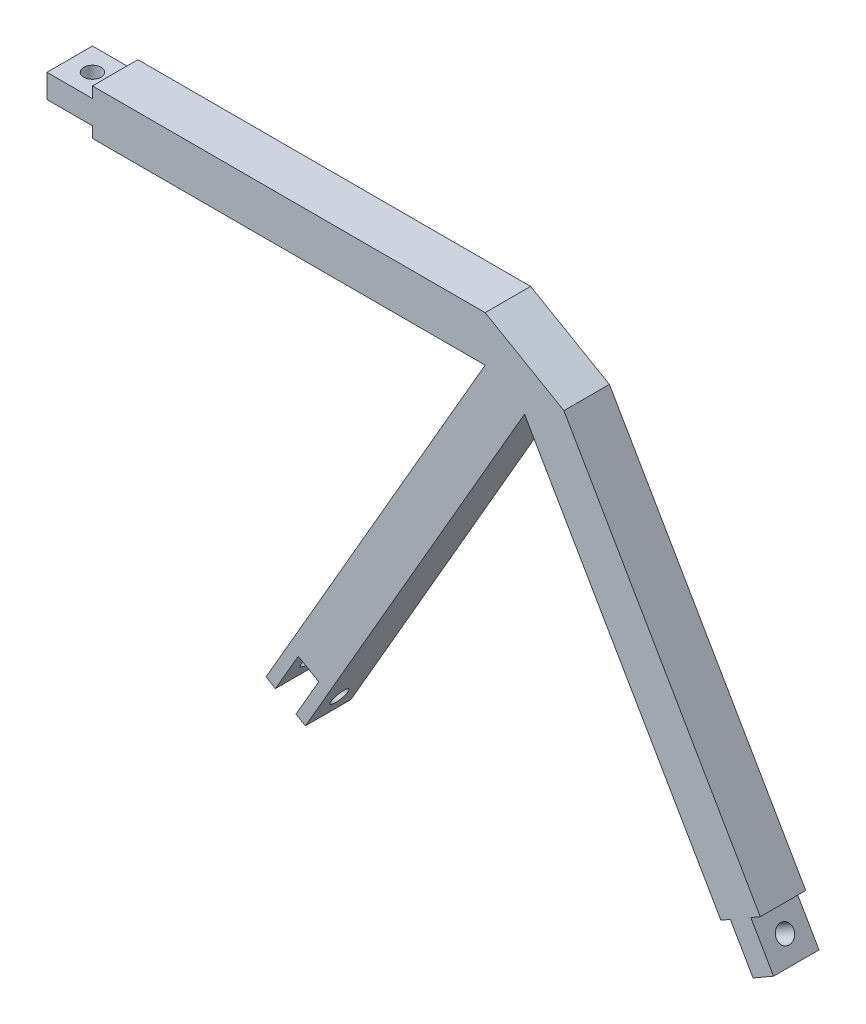
ISO-10303-21;
HEADER;
FILE_DESCRIPTION(('STEP AP214'),'2;1');
FILE_NAME('part.step','',(''),(''),'','','');
FILE_SCHEMA(('AUTOMOTIVE_DESIGN { 1 0 10303 214 1 1 1 1 }'));
ENDSEC;
DATA;
#1=APPLICATION_CONTEXT('core data for automotive mechanical design processes');
#2=APPLICATION_PROTOCOL_DEFINITION('international standard','automotive_design',2000,#1);
#3=PRODUCT_CONTEXT('',#1,'mechanical');
#4=PRODUCT('Part','Part','',(#3));
#5=PRODUCT_RELATED_PRODUCT_CATEGORY('part','',(#4));
#6=PRODUCT_DEFINITION_FORMATION('','',#4);
#7=PRODUCT_DEFINITION_CONTEXT('part definition',#1,'design');
#8=PRODUCT_DEFINITION('design','',#6,#7);
#9=PRODUCT_DEFINITION_SHAPE('','',#8);
#10=(LENGTH_UNIT() NAMED_UNIT(*) SI_UNIT(.MILLI.,.METRE.));
#11=(NAMED_UNIT(*) PLANE_ANGLE_UNIT() SI_UNIT($,.RADIAN.));
#12=(NAMED_UNIT(*) SI_UNIT($,.STERADIAN.) SOLID_ANGLE_UNIT());
#13=UNCERTAINTY_MEASURE_WITH_UNIT(LENGTH_MEASURE(1.E-05),#10,'distance_accuracy_value','');
#14=(GEOMETRIC_REPRESENTATION_CONTEXT(3) GLOBAL_UNCERTAINTY_ASSIGNED_CONTEXT((#13)) GLOBAL_UNIT_ASSIGNED_CONTEXT((#10,
#11,#12)) REPRESENTATION_CONTEXT('',''));
#15=CARTESIAN_POINT('',(0.,0.,0.));
#16=DIRECTION('',(0.,0.,1.));
#17=DIRECTION('',(1.,0.,0.));
#18=AXIS2_PLACEMENT_3D('',#15,#16,#17);
#19=CARTESIAN_POINT('',(-26.2499999999995,-41.1362066797606,0.));
#20=DIRECTION('',(-0.50000000000001,0.866025403784433,0.));
#21=DIRECTION('',(0.,0.,1.));
#22=AXIS2_PLACEMENT_3D('',#19,#20,#21);
#23=PLANE('',#22);
#24=DIRECTION('',(0.,0.,1.));
#25=VECTOR('',#24,1.);
#26=CARTESIAN_POINT('',(-25.1241669750798,-40.4862066797605,-2.5));
#27=LINE('',#26,#25);
#28=CARTESIAN_POINT('',(-25.1241669750798,-40.4862066797605,-2.5));
#29=VERTEX_POINT('',#28);
#30=CARTESIAN_POINT('',(-25.1241669750798,-40.4862066797605,2.5));
#31=VERTEX_POINT('',#30);
#32=EDGE_CURVE('E212',#29,#31,#27,.T.);
#33=ORIENTED_EDGE('',*,*,#32,.F.);
#34=DIRECTION('',(-0.866025403784433,-0.50000000000001,0.));
#35=VECTOR('',#34,1.);
#36=CARTESIAN_POINT('',(-24.0849364905384,-39.8862066797605,-2.5));
#37=LINE('',#36,#35);
#38=CARTESIAN_POINT('',(-24.0849364905384,-39.8862066797605,-2.5));
#39=VERTEX_POINT('',#38);
#40=EDGE_CURVE('E208',#39,#29,#37,.T.);
#41=ORIENTED_EDGE('',*,*,#40,.F.);
#42=DIRECTION('',(0.,0.,-1.));
#43=VECTOR('',#42,1.);
#44=CARTESIAN_POINT('',(-24.0849364905384,-39.8862066797605,-2.5));
#45=LINE('',#44,#43);
#46=CARTESIAN_POINT('',(-24.0849364905384,-39.8862066797605,2.5));
#47=VERTEX_POINT('',#46);
#48=EDGE_CURVE('E430',#47,#39,#45,.T.);
#49=ORIENTED_EDGE('',*,*,#48,.F.);
#50=DIRECTION('',(0.866025403784433,0.50000000000001,0.));
#51=VECTOR('',#50,1.);
#52=CARTESIAN_POINT('',(-24.0849364905384,-39.8862066797605,2.5));
#53=LINE('',#52,#51);
#54=EDGE_CURVE('E426',#31,#47,#53,.T.);
#55=ORIENTED_EDGE('',*,*,#54,.F.);
#56=EDGE_LOOP('',(#33,#41,#49,#55));
#57=FACE_BOUND('',#56,.T.);
#58=ADVANCED_FACE('F50',(#57),#23,.F.);
#59=CARTESIAN_POINT('',(-47.8349364905389,1.25000000000002,-2.5));
#60=DIRECTION('',(0.,0.,1.));
#61=DIRECTION('',(0.50000000000001,-0.866025403784433,0.));
#62=AXIS2_PLACEMENT_3D('',#59,#60,#61);
#63=PLANE('',#62);
#64=DIRECTION('',(0.866025403784445,-0.499999999999989,0.));
#65=VECTOR('',#64,1.);
#66=CARTESIAN_POINT('',(-12.4999999999997,-21.6506350946105,-2.5));
#67=LINE('',#66,#65);
#68=CARTESIAN_POINT('',(-54.3301270189222,2.5,-2.5));
#69=VERTEX_POINT('',#68);
#70=CARTESIAN_POINT('',(-45.6698729810778,-2.49999999999995,-2.5));
#71=VERTEX_POINT('',#70);
#72=EDGE_CURVE('E411',#69,#71,#67,.T.);
#73=ORIENTED_EDGE('',*,*,#72,.T.);
#74=DIRECTION('',(0.50000000000001,-0.866025403784433,0.));
#75=VECTOR('',#74,1.);
#76=CARTESIAN_POINT('',(-47.8349364905389,1.25000000000002,-2.5));
#77=LINE('',#76,#75);
#78=EDGE_CURVE('E434',#71,#39,#77,.T.);
#79=ORIENTED_EDGE('',*,*,#78,.T.);
#80=ORIENTED_EDGE('',*,*,#40,.T.);
#81=DIRECTION('',(-0.50000000000001,0.866025403784433,0.));
#82=VECTOR('',#81,1.);
#83=CARTESIAN_POINT('',(-25.1241669750798,-40.4862066797605,-2.5));
#84=LINE('',#83,#82);
#85=CARTESIAN_POINT('',(-22.6241669750797,-44.8163336986827,-2.5));
#86=VERTEX_POINT('',#85);
#87=EDGE_CURVE('E201',#86,#29,#84,.T.);
#88=ORIENTED_EDGE('',*,*,#87,.F.);
#89=DIRECTION('',(-0.866025403784433,-0.50000000000001,0.));
#90=VECTOR('',#89,1.);
#91=CARTESIAN_POINT('',(-22.6241669750797,-44.8163336986827,-2.5));
#92=LINE('',#91,#90);
#93=CARTESIAN_POINT('',(-24.8758330249192,-46.1163336986827,-2.5));
#94=VERTEX_POINT('',#93);
#95=EDGE_CURVE('E205',#86,#94,#92,.T.);
#96=ORIENTED_EDGE('',*,*,#95,.T.);
#97=DIRECTION('',(-0.50000000000001,0.866025403784433,0.));
#98=VECTOR('',#97,1.);
#99=CARTESIAN_POINT('',(-27.3758330249193,-41.7862066797606,-2.5));
#100=LINE('',#99,#98);
#101=CARTESIAN_POINT('',(-27.3758330249193,-41.7862066797606,-2.5));
#102=VERTEX_POINT('',#101);
#103=EDGE_CURVE('E479',#94,#102,#100,.T.);
#104=ORIENTED_EDGE('',*,*,#103,.T.);
#105=CARTESIAN_POINT('',(-28.4150635094606,-42.3862066797606,-2.5));
#106=VERTEX_POINT('',#105);
#107=EDGE_CURVE('E71',#102,#106,#37,.T.);
#108=ORIENTED_EDGE('',*,*,#107,.T.);
#109=DIRECTION('',(0.50000000000001,-0.866025403784433,0.));
#110=VECTOR('',#109,1.);
#111=CARTESIAN_POINT('',(-52.1650635094611,-1.25000000000002,-2.5));
#112=LINE('',#111,#110);
#113=CARTESIAN_POINT('',(-50.,-5.,-2.5));
#114=VERTEX_POINT('',#113);
#115=EDGE_CURVE('E12',#114,#106,#112,.T.);
#116=ORIENTED_EDGE('',*,*,#115,.F.);
#117=DIRECTION('',(-0.499999999999992,-0.866025403784443,0.));
#118=VECTOR('',#117,1.);
#119=CARTESIAN_POINT('',(-47.8349364905389,-1.24999999999998,-2.5));
#120=LINE('',#119,#118);
#121=CARTESIAN_POINT('',(-74.0849364905385,-46.7163336986833,-2.5));
#122=VERTEX_POINT('',#121);
#123=EDGE_CURVE('E360',#114,#122,#120,.T.);
#124=ORIENTED_EDGE('',*,*,#123,.T.);
#125=DIRECTION('',(-0.866025403784443,0.499999999999992,0.));
#126=VECTOR('',#125,1.);
#127=CARTESIAN_POINT('',(-74.0849364905385,-46.7163336986833,-2.5));
#128=LINE('',#127,#126);
#129=CARTESIAN_POINT('',(-75.1241669750798,-46.1163336986833,-2.5));
#130=VERTEX_POINT('',#129);
#131=EDGE_CURVE('E311',#122,#130,#128,.T.);
#132=ORIENTED_EDGE('',*,*,#131,.T.);
#133=DIRECTION('',(0.499999999999992,0.866025403784443,0.));
#134=VECTOR('',#133,1.);
#135=CARTESIAN_POINT('',(-72.6241669750798,-41.7862066797611,-2.5));
#136=LINE('',#135,#134);
#137=CARTESIAN_POINT('',(-72.6241669750798,-41.7862066797611,-2.5));
#138=VERTEX_POINT('',#137);
#139=EDGE_CURVE('E299',#130,#138,#136,.T.);
#140=ORIENTED_EDGE('',*,*,#139,.T.);
#141=DIRECTION('',(-0.866025403784443,0.499999999999992,0.));
#142=VECTOR('',#141,1.);
#143=CARTESIAN_POINT('',(-71.5849364905385,-42.386206679761,-2.5));
#144=LINE('',#143,#142);
#145=CARTESIAN_POINT('',(-74.8758330249194,-40.4862066797611,-2.5));
#146=VERTEX_POINT('',#145);
#147=EDGE_CURVE('E353',#138,#146,#144,.T.);
#148=ORIENTED_EDGE('',*,*,#147,.T.);
#149=DIRECTION('',(0.499999999999992,0.866025403784443,0.));
#150=VECTOR('',#149,1.);
#151=CARTESIAN_POINT('',(-74.8758330249194,-40.4862066797611,-2.5));
#152=LINE('',#151,#150);
#153=CARTESIAN_POINT('',(-77.3758330249193,-44.8163336986833,-2.5));
#154=VERTEX_POINT('',#153);
#155=EDGE_CURVE('E333',#154,#146,#152,.T.);
#156=ORIENTED_EDGE('',*,*,#155,.F.);
#157=DIRECTION('',(0.866025403784443,-0.499999999999992,0.));
#158=VECTOR('',#157,1.);
#159=CARTESIAN_POINT('',(-78.4150635094607,-44.2163336986833,-2.5));
#160=LINE('',#159,#158);
#161=CARTESIAN_POINT('',(-78.4150635094607,-44.2163336986833,-2.5));
#162=VERTEX_POINT('',#161);
#163=EDGE_CURVE('E328',#162,#154,#160,.T.);
#164=ORIENTED_EDGE('',*,*,#163,.F.);
#165=DIRECTION('',(-0.499999999999992,-0.866025403784443,0.));
#166=VECTOR('',#165,1.);
#167=CARTESIAN_POINT('',(-52.1650635094611,1.24999999999998,-2.5));
#168=LINE('',#167,#166);
#169=CARTESIAN_POINT('',(-54.3301270189222,-2.50000000000004,-2.5));
#170=VERTEX_POINT('',#169);
#171=EDGE_CURVE('E369',#170,#162,#168,.T.);
#172=ORIENTED_EDGE('',*,*,#171,.F.);
#173=DIRECTION('',(-1.,0.,0.));
#174=VECTOR('',#173,1.);
#175=CARTESIAN_POINT('',(-50.,-2.5,-2.5));
#176=LINE('',#175,#174);
#177=CARTESIAN_POINT('',(-97.5,-2.5,-2.5));
#178=VERTEX_POINT('',#177);
#179=EDGE_CURVE('E397',#170,#178,#176,.T.);
#180=ORIENTED_EDGE('',*,*,#179,.T.);
#181=DIRECTION('',(0.,1.,0.));
#182=VECTOR('',#181,1.);
#183=CARTESIAN_POINT('',(-97.5,-2.5,-2.5));
#184=LINE('',#183,#182);
#185=CARTESIAN_POINT('',(-97.5,-1.3,-2.5));
#186=VERTEX_POINT('',#185);
#187=EDGE_CURVE('E380',#178,#186,#184,.T.);
#188=ORIENTED_EDGE('',*,*,#187,.T.);
#189=DIRECTION('',(1.,0.,0.));
#190=VECTOR('',#189,1.);
#191=CARTESIAN_POINT('',(-97.5,-1.3,-2.5));
#192=LINE('',#191,#190);
#193=CARTESIAN_POINT('',(-102.5,-1.3,-2.5));
#194=VERTEX_POINT('',#193);
#195=EDGE_CURVE('E249',#194,#186,#192,.T.);
#196=ORIENTED_EDGE('',*,*,#195,.F.);
#197=DIRECTION('',(0.,1.,0.));
#198=VECTOR('',#197,1.);
#199=CARTESIAN_POINT('',(-102.5,-1.3,-2.5));
#200=LINE('',#199,#198);
#201=CARTESIAN_POINT('',(-102.5,1.3,-2.5));
#202=VERTEX_POINT('',#201);
#203=EDGE_CURVE('E277',#194,#202,#200,.T.);
#204=ORIENTED_EDGE('',*,*,#203,.T.);
#205=DIRECTION('',(1.,0.,0.));
#206=VECTOR('',#205,1.);
#207=CARTESIAN_POINT('',(-97.5,1.3,-2.5));
#208=LINE('',#207,#206);
#209=CARTESIAN_POINT('',(-97.5,1.3,-2.5));
#210=VERTEX_POINT('',#209);
#211=EDGE_CURVE('E265',#202,#210,#208,.T.);
#212=ORIENTED_EDGE('',*,*,#211,.T.);
#213=CARTESIAN_POINT('',(-97.5,2.5,-2.5));
#214=VERTEX_POINT('',#213);
#215=EDGE_CURVE('E379',#210,#214,#184,.T.);
#216=ORIENTED_EDGE('',*,*,#215,.T.);
#217=DIRECTION('',(-1.,0.,0.));
#218=VECTOR('',#217,1.);
#219=CARTESIAN_POINT('',(-50.,2.5,-2.5));
#220=LINE('',#219,#218);
#221=EDGE_CURVE('E407',#69,#214,#220,.T.);
#222=ORIENTED_EDGE('',*,*,#221,.F.);
#223=EDGE_LOOP('',(#73,#79,#80,#88,#96,#104,#108,#116,#124,#132,#140,#148,#156,#164,#172,#180,
#188,#196,#204,#212,#216,#222));
#224=FACE_BOUND('',#223,.T.);
#225=ADVANCED_FACE('F52',(#224),#63,.F.);
#226=CARTESIAN_POINT('',(-47.8349364905389,1.25000000000002,2.5));
#227=DIRECTION('',(0.,0.,-1.));
#228=DIRECTION('',(-0.50000000000001,0.866025403784433,0.));
#229=AXIS2_PLACEMENT_3D('',#226,#227,#228);
#230=PLANE('',#229);
#231=DIRECTION('',(-0.866025403784445,0.499999999999989,0.));
#232=VECTOR('',#231,1.);
#233=CARTESIAN_POINT('',(-12.4999999999997,-21.6506350946105,2.5));
#234=LINE('',#233,#232);
#235=CARTESIAN_POINT('',(-45.6698729810778,-2.49999999999995,2.5));
#236=VERTEX_POINT('',#235);
#237=CARTESIAN_POINT('',(-54.3301270189222,2.5,2.5));
#238=VERTEX_POINT('',#237);
#239=EDGE_CURVE('E412',#236,#238,#234,.T.);
#240=ORIENTED_EDGE('',*,*,#239,.T.);
#241=DIRECTION('',(-1.,0.,0.));
#242=VECTOR('',#241,1.);
#243=CARTESIAN_POINT('',(-50.,2.5,2.5));
#244=LINE('',#243,#242);
#245=CARTESIAN_POINT('',(-97.5,2.5,2.5));
#246=VERTEX_POINT('',#245);
#247=EDGE_CURVE('E404',#238,#246,#244,.T.);
#248=ORIENTED_EDGE('',*,*,#247,.T.);
#249=DIRECTION('',(0.,-1.,0.));
#250=VECTOR('',#249,1.);
#251=CARTESIAN_POINT('',(-97.5,-2.5,2.5));
#252=LINE('',#251,#250);
#253=CARTESIAN_POINT('',(-97.5,1.3,2.5));
#254=VERTEX_POINT('',#253);
#255=EDGE_CURVE('E389',#246,#254,#252,.T.);
#256=ORIENTED_EDGE('',*,*,#255,.T.);
#257=DIRECTION('',(-1.,0.,0.));
#258=VECTOR('',#257,1.);
#259=CARTESIAN_POINT('',(-97.5,1.3,2.5));
#260=LINE('',#259,#258);
#261=CARTESIAN_POINT('',(-102.5,1.3,2.5));
#262=VERTEX_POINT('',#261);
#263=EDGE_CURVE('E250',#254,#262,#260,.T.);
#264=ORIENTED_EDGE('',*,*,#263,.T.);
#265=DIRECTION('',(0.,1.,0.));
#266=VECTOR('',#265,1.);
#267=CARTESIAN_POINT('',(-102.5,-1.3,2.5));
#268=LINE('',#267,#266);
#269=CARTESIAN_POINT('',(-102.5,-1.3,2.5));
#270=VERTEX_POINT('',#269);
#271=EDGE_CURVE('E261',#270,#262,#268,.T.);
#272=ORIENTED_EDGE('',*,*,#271,.F.);
#273=DIRECTION('',(-1.,0.,0.));
#274=VECTOR('',#273,1.);
#275=CARTESIAN_POINT('',(-97.5,-1.3,2.5));
#276=LINE('',#275,#274);
#277=CARTESIAN_POINT('',(-97.5,-1.3,2.5));
#278=VERTEX_POINT('',#277);
#279=EDGE_CURVE('E258',#278,#270,#276,.T.);
#280=ORIENTED_EDGE('',*,*,#279,.F.);
#281=CARTESIAN_POINT('',(-97.5,-2.5,2.5));
#282=VERTEX_POINT('',#281);
#283=EDGE_CURVE('E388',#278,#282,#252,.T.);
#284=ORIENTED_EDGE('',*,*,#283,.T.);
#285=DIRECTION('',(-1.,0.,0.));
#286=VECTOR('',#285,1.);
#287=CARTESIAN_POINT('',(-50.,-2.5,2.5));
#288=LINE('',#287,#286);
#289=CARTESIAN_POINT('',(-54.3301270189222,-2.50000000000004,2.5));
#290=VERTEX_POINT('',#289);
#291=EDGE_CURVE('E400',#290,#282,#288,.T.);
#292=ORIENTED_EDGE('',*,*,#291,.F.);
#293=DIRECTION('',(-0.499999999999992,-0.866025403784443,0.));
#294=VECTOR('',#293,1.);
#295=CARTESIAN_POINT('',(-52.1650635094611,1.24999999999998,2.5));
#296=LINE('',#295,#294);
#297=CARTESIAN_POINT('',(-78.4150635094607,-44.2163336986833,2.5));
#298=VERTEX_POINT('',#297);
#299=EDGE_CURVE('E366',#290,#298,#296,.T.);
#300=ORIENTED_EDGE('',*,*,#299,.T.);
#301=DIRECTION('',(0.866025403784443,-0.499999999999992,0.));
#302=VECTOR('',#301,1.);
#303=CARTESIAN_POINT('',(-78.4150635094607,-44.2163336986833,2.5));
#304=LINE('',#303,#302);
#305=CARTESIAN_POINT('',(-77.3758330249193,-44.8163336986833,2.5));
#306=VERTEX_POINT('',#305);
#307=EDGE_CURVE('E344',#298,#306,#304,.T.);
#308=ORIENTED_EDGE('',*,*,#307,.T.);
#309=DIRECTION('',(-0.499999999999992,-0.866025403784443,0.));
#310=VECTOR('',#309,1.);
#311=CARTESIAN_POINT('',(-74.8758330249194,-40.4862066797611,2.5));
#312=LINE('',#311,#310);
#313=CARTESIAN_POINT('',(-74.8758330249194,-40.4862066797611,2.5));
#314=VERTEX_POINT('',#313);
#315=EDGE_CURVE('E329',#314,#306,#312,.T.);
#316=ORIENTED_EDGE('',*,*,#315,.F.);
#317=DIRECTION('',(0.866025403784443,-0.499999999999992,0.));
#318=VECTOR('',#317,1.);
#319=CARTESIAN_POINT('',(-71.5849364905385,-42.386206679761,2.5));
#320=LINE('',#319,#318);
#321=CARTESIAN_POINT('',(-72.6241669750798,-41.7862066797611,2.5));
#322=VERTEX_POINT('',#321);
#323=EDGE_CURVE('E356',#314,#322,#320,.T.);
#324=ORIENTED_EDGE('',*,*,#323,.T.);
#325=DIRECTION('',(-0.499999999999992,-0.866025403784443,0.));
#326=VECTOR('',#325,1.);
#327=CARTESIAN_POINT('',(-72.6241669750798,-41.7862066797611,2.5));
#328=LINE('',#327,#326);
#329=CARTESIAN_POINT('',(-75.1241669750798,-46.1163336986833,2.5));
#330=VERTEX_POINT('',#329);
#331=EDGE_CURVE('E295',#322,#330,#328,.T.);
#332=ORIENTED_EDGE('',*,*,#331,.T.);
#333=DIRECTION('',(-0.866025403784443,0.499999999999992,0.));
#334=VECTOR('',#333,1.);
#335=CARTESIAN_POINT('',(-74.0849364905385,-46.7163336986833,2.5));
#336=LINE('',#335,#334);
#337=CARTESIAN_POINT('',(-74.0849364905385,-46.7163336986833,2.5));
#338=VERTEX_POINT('',#337);
#339=EDGE_CURVE('E294',#338,#330,#336,.T.);
#340=ORIENTED_EDGE('',*,*,#339,.F.);
#341=DIRECTION('',(-0.499999999999992,-0.866025403784443,0.));
#342=VECTOR('',#341,1.);
#343=CARTESIAN_POINT('',(-47.8349364905389,-1.24999999999998,2.5));
#344=LINE('',#343,#342);
#345=CARTESIAN_POINT('',(-50.,-5.,2.5));
#346=VERTEX_POINT('',#345);
#347=EDGE_CURVE('E363',#346,#338,#344,.T.);
#348=ORIENTED_EDGE('',*,*,#347,.F.);
#349=DIRECTION('',(0.50000000000001,-0.866025403784433,0.));
#350=VECTOR('',#349,1.);
#351=CARTESIAN_POINT('',(-52.1650635094611,-1.25000000000002,2.5));
#352=LINE('',#351,#350);
#353=CARTESIAN_POINT('',(-28.4150635094606,-42.3862066797606,2.5));
#354=VERTEX_POINT('',#353);
#355=EDGE_CURVE('E59',#346,#354,#352,.T.);
#356=ORIENTED_EDGE('',*,*,#355,.T.);
#357=CARTESIAN_POINT('',(-27.3758330249193,-41.7862066797606,2.5));
#358=VERTEX_POINT('',#357);
#359=EDGE_CURVE('E427',#354,#358,#53,.T.);
#360=ORIENTED_EDGE('',*,*,#359,.T.);
#361=DIRECTION('',(0.50000000000001,-0.866025403784433,0.));
#362=VECTOR('',#361,1.);
#363=CARTESIAN_POINT('',(-27.3758330249193,-41.7862066797606,2.5));
#364=LINE('',#363,#362);
#365=CARTESIAN_POINT('',(-24.8758330249192,-46.1163336986827,2.5));
#366=VERTEX_POINT('',#365);
#367=EDGE_CURVE('E224',#358,#366,#364,.T.);
#368=ORIENTED_EDGE('',*,*,#367,.T.);
#369=DIRECTION('',(-0.866025403784433,-0.50000000000001,0.));
#370=VECTOR('',#369,1.);
#371=CARTESIAN_POINT('',(-22.6241669750797,-44.8163336986827,2.5));
#372=LINE('',#371,#370);
#373=CARTESIAN_POINT('',(-22.6241669750797,-44.8163336986827,2.5));
#374=VERTEX_POINT('',#373);
#375=EDGE_CURVE('E231',#374,#366,#372,.T.);
#376=ORIENTED_EDGE('',*,*,#375,.F.);
#377=DIRECTION('',(0.50000000000001,-0.866025403784433,0.));
#378=VECTOR('',#377,1.);
#379=CARTESIAN_POINT('',(-25.1241669750798,-40.4862066797605,2.5));
#380=LINE('',#379,#378);
#381=EDGE_CURVE('E219',#31,#374,#380,.T.);
#382=ORIENTED_EDGE('',*,*,#381,.F.);
#383=ORIENTED_EDGE('',*,*,#54,.T.);
#384=DIRECTION('',(0.50000000000001,-0.866025403784433,0.));
#385=VECTOR('',#384,1.);
#386=CARTESIAN_POINT('',(-47.8349364905389,1.25000000000002,2.5));
#387=LINE('',#386,#385);
#388=EDGE_CURVE('E437',#236,#47,#387,.T.);
#389=ORIENTED_EDGE('',*,*,#388,.F.);
#390=EDGE_LOOP('',(#240,#248,#256,#264,#272,#280,#284,#292,#300,#308,#316,#324,#332,#340,#348,
#356,#360,#368,#376,#382,#383,#389));
#391=FACE_BOUND('',#390,.T.);
#392=ADVANCED_FACE('F444',(#391),#230,.F.);
#393=CARTESIAN_POINT('',(-47.8349364905389,1.25000000000002,-2.5));
#394=DIRECTION('',(-0.866025403784433,-0.50000000000001,0.));
#395=DIRECTION('',(0.,0.,-1.));
#396=AXIS2_PLACEMENT_3D('',#393,#394,#395);
#397=PLANE('',#396);
#398=DIRECTION('',(0.,0.,-1.));
#399=VECTOR('',#398,1.);
#400=CARTESIAN_POINT('',(-45.6698729810778,-2.49999999999995,7.5));
#401=LINE('',#400,#399);
#402=EDGE_CURVE('E415',#236,#71,#401,.T.);
#403=ORIENTED_EDGE('',*,*,#402,.F.);
#404=ORIENTED_EDGE('',*,*,#388,.T.);
#405=ORIENTED_EDGE('',*,*,#48,.T.);
#406=ORIENTED_EDGE('',*,*,#78,.F.);
#407=EDGE_LOOP('',(#403,#404,#405,#406));
#408=FACE_BOUND('',#407,.T.);
#409=ADVANCED_FACE('F463',(#408),#397,.F.);
#410=CARTESIAN_POINT('',(-52.1650635094611,-1.25000000000002,-2.5));
#411=DIRECTION('',(0.866025403784433,0.50000000000001,0.));
#412=DIRECTION('',(0.,0.,1.));
#413=AXIS2_PLACEMENT_3D('',#410,#411,#412);
#414=PLANE('',#413);
#415=ORIENTED_EDGE('',*,*,#355,.F.);
#416=DIRECTION('',(0.,0.,-1.));
#417=VECTOR('',#416,1.);
#418=CARTESIAN_POINT('',(-50.,-5.,7.5));
#419=LINE('',#418,#417);
#420=EDGE_CURVE('E347',#346,#114,#419,.T.);
#421=ORIENTED_EDGE('',*,*,#420,.T.);
#422=ORIENTED_EDGE('',*,*,#115,.T.);
#423=DIRECTION('',(0.,0.,1.));
#424=VECTOR('',#423,1.);
#425=CARTESIAN_POINT('',(-28.4150635094606,-42.3862066797606,-2.5));
#426=LINE('',#425,#424);
#427=EDGE_CURVE('E422',#106,#354,#426,.T.);
#428=ORIENTED_EDGE('',*,*,#427,.T.);
#429=EDGE_LOOP('',(#415,#421,#422,#428));
#430=FACE_BOUND('',#429,.T.);
#431=ADVANCED_FACE('F448',(#430),#414,.F.);
#432=ORIENTED_EDGE('',*,*,#107,.F.);
#433=DIRECTION('',(0.,0.,1.));
#434=VECTOR('',#433,1.);
#435=CARTESIAN_POINT('',(-27.3758330249193,-41.7862066797606,-2.5));
#436=LINE('',#435,#434);
#437=EDGE_CURVE('E66',#102,#358,#436,.T.);
#438=ORIENTED_EDGE('',*,*,#437,.T.);
#439=ORIENTED_EDGE('',*,*,#359,.F.);
#440=ORIENTED_EDGE('',*,*,#427,.F.);
#441=EDGE_LOOP('',(#432,#438,#439,#440));
#442=FACE_BOUND('',#441,.T.);
#443=ADVANCED_FACE('F450',(#442),#23,.F.);
#444=CARTESIAN_POINT('',(-12.4999999999997,-21.6506350946105,7.5));
#445=DIRECTION('',(0.499999999999989,0.866025403784445,0.));
#446=DIRECTION('',(-0.866025403784445,0.499999999999989,0.));
#447=AXIS2_PLACEMENT_3D('',#444,#445,#446);
#448=PLANE('',#447);
#449=ORIENTED_EDGE('',*,*,#402,.T.);
#450=ORIENTED_EDGE('',*,*,#72,.F.);
#451=DIRECTION('',(0.,0.,-1.));
#452=VECTOR('',#451,1.);
#453=CARTESIAN_POINT('',(-54.3301270189222,2.5,7.5));
#454=LINE('',#453,#452);
#455=EDGE_CURVE('E375',#238,#69,#454,.T.);
#456=ORIENTED_EDGE('',*,*,#455,.F.);
#457=ORIENTED_EDGE('',*,*,#239,.F.);
#458=EDGE_LOOP('',(#449,#450,#456,#457));
#459=FACE_BOUND('',#458,.T.);
#460=ADVANCED_FACE('F452',(#459),#448,.T.);
#461=CARTESIAN_POINT('',(-97.5,0.,0.));
#462=DIRECTION('',(1.,0.,0.));
#463=DIRECTION('',(0.,0.,1.));
#464=AXIS2_PLACEMENT_3D('',#461,#462,#463);
#465=PLANE('',#464);
#466=DIRECTION('',(0.,0.,1.));
#467=VECTOR('',#466,1.);
#468=CARTESIAN_POINT('',(-97.5,-1.3,-2.5));
#469=LINE('',#468,#467);
#470=EDGE_CURVE('E254',#186,#278,#469,.T.);
#471=ORIENTED_EDGE('',*,*,#470,.F.);
#472=ORIENTED_EDGE('',*,*,#187,.F.);
#473=DIRECTION('',(0.,0.,-1.));
#474=VECTOR('',#473,1.);
#475=CARTESIAN_POINT('',(-97.5,-2.5,-2.5));
#476=LINE('',#475,#474);
#477=EDGE_CURVE('E393',#282,#178,#476,.T.);
#478=ORIENTED_EDGE('',*,*,#477,.F.);
#479=ORIENTED_EDGE('',*,*,#283,.F.);
#480=EDGE_LOOP('',(#471,#472,#478,#479));
#481=FACE_BOUND('',#480,.T.);
#482=ADVANCED_FACE('F459',(#481),#465,.F.);
#483=CARTESIAN_POINT('',(-50.,-2.5,-2.5));
#484=DIRECTION('',(0.,1.,0.));
#485=DIRECTION('',(0.,0.,-1.));
#486=AXIS2_PLACEMENT_3D('',#483,#484,#485);
#487=PLANE('',#486);
#488=DIRECTION('',(0.,0.,-1.));
#489=VECTOR('',#488,1.);
#490=CARTESIAN_POINT('',(-54.3301270189222,-2.5,7.5));
#491=LINE('',#490,#489);
#492=EDGE_CURVE('E372',#290,#170,#491,.T.);
#493=ORIENTED_EDGE('',*,*,#492,.F.);
#494=ORIENTED_EDGE('',*,*,#291,.T.);
#495=ORIENTED_EDGE('',*,*,#477,.T.);
#496=ORIENTED_EDGE('',*,*,#179,.F.);
#497=EDGE_LOOP('',(#493,#494,#495,#496));
#498=FACE_BOUND('',#497,.T.);
#499=ADVANCED_FACE('F524',(#498),#487,.F.);
#500=CARTESIAN_POINT('',(-50.,2.5,-2.5));
#501=DIRECTION('',(0.,-1.,0.));
#502=DIRECTION('',(0.,0.,1.));
#503=AXIS2_PLACEMENT_3D('',#500,#501,#502);
#504=PLANE('',#503);
#505=ORIENTED_EDGE('',*,*,#247,.F.);
#506=ORIENTED_EDGE('',*,*,#455,.T.);
#507=ORIENTED_EDGE('',*,*,#221,.T.);
#508=DIRECTION('',(0.,0.,1.));
#509=VECTOR('',#508,1.);
#510=CARTESIAN_POINT('',(-97.5,2.5,-2.5));
#511=LINE('',#510,#509);
#512=EDGE_CURVE('E384',#214,#246,#511,.T.);
#513=ORIENTED_EDGE('',*,*,#512,.T.);
#514=EDGE_LOOP('',(#505,#506,#507,#513));
#515=FACE_BOUND('',#514,.T.);
#516=ADVANCED_FACE('F497',(#515),#504,.F.);
#517=ORIENTED_EDGE('',*,*,#215,.F.);
#518=DIRECTION('',(0.,0.,1.));
#519=VECTOR('',#518,1.);
#520=CARTESIAN_POINT('',(-97.5,1.3,-2.5));
#521=LINE('',#520,#519);
#522=EDGE_CURVE('E269',#210,#254,#521,.T.);
#523=ORIENTED_EDGE('',*,*,#522,.T.);
#524=ORIENTED_EDGE('',*,*,#255,.F.);
#525=ORIENTED_EDGE('',*,*,#512,.F.);
#526=EDGE_LOOP('',(#517,#523,#524,#525));
#527=FACE_BOUND('',#526,.T.);
#528=ADVANCED_FACE('F500',(#527),#465,.F.);
#529=CARTESIAN_POINT('',(-73.7499999999996,-41.1362066797611,0.));
#530=DIRECTION('',(0.499999999999992,0.866025403784443,0.));
#531=DIRECTION('',(0.,0.,1.));
#532=AXIS2_PLACEMENT_3D('',#529,#530,#531);
#533=PLANE('',#532);
#534=ORIENTED_EDGE('',*,*,#147,.F.);
#535=DIRECTION('',(0.,0.,1.));
#536=VECTOR('',#535,1.);
#537=CARTESIAN_POINT('',(-72.6241669750798,-41.7862066797611,-2.5));
#538=LINE('',#537,#536);
#539=EDGE_CURVE('E302',#138,#322,#538,.T.);
#540=ORIENTED_EDGE('',*,*,#539,.T.);
#541=ORIENTED_EDGE('',*,*,#323,.F.);
#542=DIRECTION('',(0.,0.,1.));
#543=VECTOR('',#542,1.);
#544=CARTESIAN_POINT('',(-74.8758330249194,-40.4862066797611,-2.5));
#545=LINE('',#544,#543);
#546=EDGE_CURVE('E337',#146,#314,#545,.T.);
#547=ORIENTED_EDGE('',*,*,#546,.F.);
#548=EDGE_LOOP('',(#534,#540,#541,#547));
#549=FACE_BOUND('',#548,.T.);
#550=ADVANCED_FACE('F540',(#549),#533,.F.);
#551=CARTESIAN_POINT('',(-47.8349364905389,-1.24999999999998,-2.5));
#552=DIRECTION('',(-0.866025403784443,0.499999999999992,0.));
#553=DIRECTION('',(0.,0.,-1.));
#554=AXIS2_PLACEMENT_3D('',#551,#552,#553);
#555=PLANE('',#554);
#556=ORIENTED_EDGE('',*,*,#420,.F.);
#557=ORIENTED_EDGE('',*,*,#347,.T.);
#558=DIRECTION('',(0.,0.,-1.));
#559=VECTOR('',#558,1.);
#560=CARTESIAN_POINT('',(-74.0849364905385,-46.7163336986833,-2.5));
#561=LINE('',#560,#559);
#562=EDGE_CURVE('E290',#338,#122,#561,.T.);
#563=ORIENTED_EDGE('',*,*,#562,.T.);
#564=ORIENTED_EDGE('',*,*,#123,.F.);
#565=EDGE_LOOP('',(#556,#557,#563,#564));
#566=FACE_BOUND('',#565,.T.);
#567=CARTESIAN_POINT('',(-72.8349364905385,-44.5512701892222,0.));
#568=DIRECTION('',(0.866025403784443,-0.499999999999992,0.));
#569=DIRECTION('',(0.,0.,1.));
#570=AXIS2_PLACEMENT_3D('',#567,#568,#569);
#571=CIRCLE('',#570,0.95);
#572=CARTESIAN_POINT('',(-72.8349364905385,-44.5512701892222,0.95));
#573=VERTEX_POINT('',#572);
#574=EDGE_CURVE('E282',#573,#573,#571,.T.);
#575=ORIENTED_EDGE('',*,*,#574,.F.);
#576=EDGE_LOOP('',(#575));
#577=FACE_BOUND('',#576,.T.);
#578=ADVANCED_FACE('F551',(#566,#577),#555,.F.);
#579=CARTESIAN_POINT('',(-52.1650635094611,1.24999999999998,-2.5));
#580=DIRECTION('',(0.866025403784443,-0.499999999999992,0.));
#581=DIRECTION('',(0.,0.,1.));
#582=AXIS2_PLACEMENT_3D('',#579,#580,#581);
#583=PLANE('',#582);
#584=ORIENTED_EDGE('',*,*,#299,.F.);
#585=ORIENTED_EDGE('',*,*,#492,.T.);
#586=ORIENTED_EDGE('',*,*,#171,.T.);
#587=DIRECTION('',(0.,0.,-1.));
#588=VECTOR('',#587,1.);
#589=CARTESIAN_POINT('',(-78.4150635094607,-44.2163336986833,-2.5));
#590=LINE('',#589,#588);
#591=EDGE_CURVE('E324',#298,#162,#590,.T.);
#592=ORIENTED_EDGE('',*,*,#591,.F.);
#593=EDGE_LOOP('',(#584,#585,#586,#592));
#594=FACE_BOUND('',#593,.T.);
#595=CARTESIAN_POINT('',(-77.1650635094607,-42.0512701892222,0.));
#596=DIRECTION('',(0.866025403784443,-0.499999999999992,0.));
#597=DIRECTION('',(0.,0.,1.));
#598=AXIS2_PLACEMENT_3D('',#595,#596,#597);
#599=CIRCLE('',#598,0.95);
#600=CARTESIAN_POINT('',(-77.1650635094607,-42.0512701892222,0.95));
#601=VERTEX_POINT('',#600);
#602=EDGE_CURVE('E316',#601,#601,#599,.T.);
#603=ORIENTED_EDGE('',*,*,#602,.T.);
#604=EDGE_LOOP('',(#603));
#605=FACE_BOUND('',#604,.T.);
#606=ADVANCED_FACE('F532',(#594,#605),#583,.F.);
#607=CARTESIAN_POINT('',(-78.4150635094607,-44.2163336986833,-2.5));
#608=DIRECTION('',(-0.499999999999992,-0.866025403784443,0.));
#609=DIRECTION('',(0.,0.,-1.));
#610=AXIS2_PLACEMENT_3D('',#607,#608,#609);
#611=PLANE('',#610);
#612=DIRECTION('',(0.,0.,-1.));
#613=VECTOR('',#612,1.);
#614=CARTESIAN_POINT('',(-77.3758330249193,-44.8163336986833,-2.5));
#615=LINE('',#614,#613);
#616=EDGE_CURVE('E320',#306,#154,#615,.T.);
#617=ORIENTED_EDGE('',*,*,#616,.F.);
#618=ORIENTED_EDGE('',*,*,#307,.F.);
#619=ORIENTED_EDGE('',*,*,#591,.T.);
#620=ORIENTED_EDGE('',*,*,#163,.T.);
#621=EDGE_LOOP('',(#617,#618,#619,#620));
#622=FACE_BOUND('',#621,.T.);
#623=ADVANCED_FACE('F531',(#622),#611,.T.);
#624=CARTESIAN_POINT('',(-76.1258330249194,-42.6512701892222,0.));
#625=DIRECTION('',(0.866025403784443,-0.499999999999992,0.));
#626=DIRECTION('',(0.,0.,1.));
#627=AXIS2_PLACEMENT_3D('',#624,#625,#626);
#628=PLANE('',#627);
#629=CARTESIAN_POINT('',(-76.1258330249194,-42.6512701892222,0.));
#630=DIRECTION('',(0.866025403784443,-0.499999999999992,0.));
#631=DIRECTION('',(0.,0.,1.));
#632=AXIS2_PLACEMENT_3D('',#629,#630,#631);
#633=CIRCLE('',#632,0.95);
#634=CARTESIAN_POINT('',(-76.1258330249194,-42.6512701892222,0.95));
#635=VERTEX_POINT('',#634);
#636=EDGE_CURVE('E315',#635,#635,#633,.T.);
#637=ORIENTED_EDGE('',*,*,#636,.F.);
#638=EDGE_LOOP('',(#637));
#639=FACE_BOUND('',#638,.T.);
#640=ORIENTED_EDGE('',*,*,#616,.T.);
#641=ORIENTED_EDGE('',*,*,#155,.T.);
#642=ORIENTED_EDGE('',*,*,#546,.T.);
#643=ORIENTED_EDGE('',*,*,#315,.T.);
#644=EDGE_LOOP('',(#640,#641,#642,#643));
#645=FACE_BOUND('',#644,.T.);
#646=ADVANCED_FACE('F538',(#639,#645),#628,.T.);
#647=CARTESIAN_POINT('',(-77.1650635094607,-42.0512701892222,0.));
#648=DIRECTION('',(0.866025403784443,-0.499999999999992,0.));
#649=DIRECTION('',(0.,0.,1.));
#650=AXIS2_PLACEMENT_3D('',#647,#648,#649);
#651=CYLINDRICAL_SURFACE('',#650,0.95);
#652=ORIENTED_EDGE('',*,*,#602,.F.);
#653=EDGE_LOOP('',(#652));
#654=FACE_BOUND('',#653,.T.);
#655=ORIENTED_EDGE('',*,*,#636,.T.);
#656=EDGE_LOOP('',(#655));
#657=FACE_BOUND('',#656,.T.);
#658=ADVANCED_FACE('F563',(#654,#657),#651,.F.);
#659=CARTESIAN_POINT('',(-73.8741669750798,-43.9512701892222,0.));
#660=DIRECTION('',(0.866025403784443,-0.499999999999992,0.));
#661=DIRECTION('',(0.,0.,1.));
#662=AXIS2_PLACEMENT_3D('',#659,#660,#661);
#663=PLANE('',#662);
#664=DIRECTION('',(0.,0.,-1.));
#665=VECTOR('',#664,1.);
#666=CARTESIAN_POINT('',(-75.1241669750798,-46.1163336986833,-2.5));
#667=LINE('',#666,#665);
#668=EDGE_CURVE('E286',#330,#130,#667,.T.);
#669=ORIENTED_EDGE('',*,*,#668,.F.);
#670=ORIENTED_EDGE('',*,*,#331,.F.);
#671=ORIENTED_EDGE('',*,*,#539,.F.);
#672=ORIENTED_EDGE('',*,*,#139,.F.);
#673=EDGE_LOOP('',(#669,#670,#671,#672));
#674=FACE_BOUND('',#673,.T.);
#675=CARTESIAN_POINT('',(-73.8741669750798,-43.9512701892222,0.));
#676=DIRECTION('',(0.866025403784443,-0.499999999999992,0.));
#677=DIRECTION('',(0.,0.,1.));
#678=AXIS2_PLACEMENT_3D('',#675,#676,#677);
#679=CIRCLE('',#678,0.95);
#680=CARTESIAN_POINT('',(-73.8741669750798,-43.9512701892222,0.95));
#681=VERTEX_POINT('',#680);
#682=EDGE_CURVE('E281',#681,#681,#679,.T.);
#683=ORIENTED_EDGE('',*,*,#682,.T.);
#684=EDGE_LOOP('',(#683));
#685=FACE_BOUND('',#684,.T.);
#686=ADVANCED_FACE('F544',(#674,#685),#663,.F.);
#687=CARTESIAN_POINT('',(-74.0849364905385,-46.7163336986833,-2.5));
#688=DIRECTION('',(0.499999999999992,0.866025403784443,0.));
#689=DIRECTION('',(0.,0.,1.));
#690=AXIS2_PLACEMENT_3D('',#687,#688,#689);
#691=PLANE('',#690);
#692=ORIENTED_EDGE('',*,*,#668,.T.);
#693=ORIENTED_EDGE('',*,*,#131,.F.);
#694=ORIENTED_EDGE('',*,*,#562,.F.);
#695=ORIENTED_EDGE('',*,*,#339,.T.);
#696=EDGE_LOOP('',(#692,#693,#694,#695));
#697=FACE_BOUND('',#696,.T.);
#698=ADVANCED_FACE('F548',(#697),#691,.F.);
#699=CARTESIAN_POINT('',(-72.8349364905385,-44.5512701892222,0.));
#700=DIRECTION('',(-0.866025403784443,0.499999999999992,0.));
#701=DIRECTION('',(0.,0.,-1.));
#702=AXIS2_PLACEMENT_3D('',#699,#700,#701);
#703=CYLINDRICAL_SURFACE('',#702,0.95);
#704=ORIENTED_EDGE('',*,*,#574,.T.);
#705=EDGE_LOOP('',(#704));
#706=FACE_BOUND('',#705,.T.);
#707=ORIENTED_EDGE('',*,*,#682,.F.);
#708=EDGE_LOOP('',(#707));
#709=FACE_BOUND('',#708,.T.);
#710=ADVANCED_FACE('F557',(#706,#709),#703,.F.);
#711=CARTESIAN_POINT('',(-100.,-1.3,0.));
#712=DIRECTION('',(0.,-1.,0.));
#713=DIRECTION('',(0.,0.,1.));
#714=AXIS2_PLACEMENT_3D('',#711,#712,#713);
#715=PLANE('',#714);
#716=DIRECTION('',(0.,0.,-1.));
#717=VECTOR('',#716,1.);
#718=CARTESIAN_POINT('',(-102.5,-1.3,-2.5));
#719=LINE('',#718,#717);
#720=EDGE_CURVE('E245',#270,#194,#719,.T.);
#721=ORIENTED_EDGE('',*,*,#720,.T.);
#722=ORIENTED_EDGE('',*,*,#195,.T.);
#723=ORIENTED_EDGE('',*,*,#470,.T.);
#724=ORIENTED_EDGE('',*,*,#279,.T.);
#725=EDGE_LOOP('',(#721,#722,#723,#724));
#726=FACE_BOUND('',#725,.T.);
#727=CARTESIAN_POINT('',(-100.,-1.3,0.));
#728=DIRECTION('',(0.,-1.,0.));
#729=DIRECTION('',(0.,0.,1.));
#730=AXIS2_PLACEMENT_3D('',#727,#728,#729);
#731=CIRCLE('',#730,0.95);
#732=CARTESIAN_POINT('',(-100.,-1.3,0.95));
#733=VERTEX_POINT('',#732);
#734=EDGE_CURVE('E236',#733,#733,#731,.T.);
#735=ORIENTED_EDGE('',*,*,#734,.F.);
#736=EDGE_LOOP('',(#735));
#737=FACE_BOUND('',#736,.T.);
#738=ADVANCED_FACE('F514',(#726,#737),#715,.T.);
#739=CARTESIAN_POINT('',(-100.,1.3,0.));
#740=DIRECTION('',(0.,-1.,0.));
#741=DIRECTION('',(0.,0.,1.));
#742=AXIS2_PLACEMENT_3D('',#739,#740,#741);
#743=PLANE('',#742);
#744=DIRECTION('',(0.,0.,-1.));
#745=VECTOR('',#744,1.);
#746=CARTESIAN_POINT('',(-102.5,1.3,-2.5));
#747=LINE('',#746,#745);
#748=EDGE_CURVE('E243',#262,#202,#747,.T.);
#749=ORIENTED_EDGE('',*,*,#748,.F.);
#750=ORIENTED_EDGE('',*,*,#263,.F.);
#751=ORIENTED_EDGE('',*,*,#522,.F.);
#752=ORIENTED_EDGE('',*,*,#211,.F.);
#753=EDGE_LOOP('',(#749,#750,#751,#752));
#754=FACE_BOUND('',#753,.T.);
#755=CARTESIAN_POINT('',(-100.,1.3,0.));
#756=DIRECTION('',(0.,-1.,0.));
#757=DIRECTION('',(0.,0.,1.));
#758=AXIS2_PLACEMENT_3D('',#755,#756,#757);
#759=CIRCLE('',#758,0.95);
#760=CARTESIAN_POINT('',(-100.,1.3,0.95));
#761=VERTEX_POINT('',#760);
#762=EDGE_CURVE('E230',#761,#761,#759,.T.);
#763=ORIENTED_EDGE('',*,*,#762,.T.);
#764=EDGE_LOOP('',(#763));
#765=FACE_BOUND('',#764,.T.);
#766=ADVANCED_FACE('F505',(#754,#765),#743,.F.);
#767=CARTESIAN_POINT('',(-102.5,-1.3,-2.5));
#768=DIRECTION('',(1.,0.,0.));
#769=DIRECTION('',(0.,0.,1.));
#770=AXIS2_PLACEMENT_3D('',#767,#768,#769);
#771=PLANE('',#770);
#772=ORIENTED_EDGE('',*,*,#748,.T.);
#773=ORIENTED_EDGE('',*,*,#203,.F.);
#774=ORIENTED_EDGE('',*,*,#720,.F.);
#775=ORIENTED_EDGE('',*,*,#271,.T.);
#776=EDGE_LOOP('',(#772,#773,#774,#775));
#777=FACE_BOUND('',#776,.T.);
#778=ADVANCED_FACE('F509',(#777),#771,.F.);
#779=CARTESIAN_POINT('',(-100.,-1.3,0.));
#780=DIRECTION('',(0.,1.,0.));
#781=DIRECTION('',(0.,0.,-1.));
#782=AXIS2_PLACEMENT_3D('',#779,#780,#781);
#783=CYLINDRICAL_SURFACE('',#782,0.95);
#784=ORIENTED_EDGE('',*,*,#734,.T.);
#785=EDGE_LOOP('',(#784));
#786=FACE_BOUND('',#785,.T.);
#787=ORIENTED_EDGE('',*,*,#762,.F.);
#788=EDGE_LOOP('',(#787));
#789=FACE_BOUND('',#788,.T.);
#790=ADVANCED_FACE('F688',(#786,#789),#783,.F.);
#791=CARTESIAN_POINT('',(-23.8741669750797,-42.6512701892216,0.));
#792=DIRECTION('',(0.866025403784433,0.50000000000001,0.));
#793=DIRECTION('',(0.,0.,1.));
#794=AXIS2_PLACEMENT_3D('',#791,#792,#793);
#795=PLANE('',#794);
#796=DIRECTION('',(0.,0.,-1.));
#797=VECTOR('',#796,1.);
#798=CARTESIAN_POINT('',(-22.6241669750797,-44.8163336986827,-2.5));
#799=LINE('',#798,#797);
#800=EDGE_CURVE('E213',#374,#86,#799,.T.);
#801=ORIENTED_EDGE('',*,*,#800,.T.);
#802=ORIENTED_EDGE('',*,*,#87,.T.);
#803=ORIENTED_EDGE('',*,*,#32,.T.);
#804=ORIENTED_EDGE('',*,*,#381,.T.);
#805=EDGE_LOOP('',(#801,#802,#803,#804));
#806=FACE_BOUND('',#805,.T.);
#807=CARTESIAN_POINT('',(-23.8741669750797,-42.6512701892216,0.));
#808=DIRECTION('',(0.866025403784433,0.50000000000001,0.));
#809=DIRECTION('',(0.,0.,1.));
#810=AXIS2_PLACEMENT_3D('',#807,#808,#809);
#811=CIRCLE('',#810,0.95);
#812=CARTESIAN_POINT('',(-23.8741669750797,-42.6512701892216,0.95));
#813=VERTEX_POINT('',#812);
#814=EDGE_CURVE('E480',#813,#813,#811,.T.);
#815=ORIENTED_EDGE('',*,*,#814,.F.);
#816=EDGE_LOOP('',(#815));
#817=FACE_BOUND('',#816,.T.);
#818=ADVANCED_FACE('F216',(#806,#817),#795,.T.);
#819=CARTESIAN_POINT('',(-26.1258330249193,-43.9512701892217,0.));
#820=DIRECTION('',(0.866025403784433,0.50000000000001,0.));
#821=DIRECTION('',(0.,0.,1.));
#822=AXIS2_PLACEMENT_3D('',#819,#820,#821);
#823=PLANE('',#822);
#824=DIRECTION('',(0.,0.,-1.));
#825=VECTOR('',#824,1.);
#826=CARTESIAN_POINT('',(-24.8758330249192,-46.1163336986827,-2.5));
#827=LINE('',#826,#825);
#828=EDGE_CURVE('E228',#366,#94,#827,.T.);
#829=ORIENTED_EDGE('',*,*,#828,.F.);
#830=ORIENTED_EDGE('',*,*,#367,.F.);
#831=ORIENTED_EDGE('',*,*,#437,.F.);
#832=ORIENTED_EDGE('',*,*,#103,.F.);
#833=EDGE_LOOP('',(#829,#830,#831,#832));
#834=FACE_BOUND('',#833,.T.);
#835=CARTESIAN_POINT('',(-26.1258330249193,-43.9512701892217,0.));
#836=DIRECTION('',(0.866025403784433,0.50000000000001,0.));
#837=DIRECTION('',(0.,0.,1.));
#838=AXIS2_PLACEMENT_3D('',#835,#836,#837);
#839=CIRCLE('',#838,0.95);
#840=CARTESIAN_POINT('',(-26.1258330249193,-43.9512701892217,0.95));
#841=VERTEX_POINT('',#840);
#842=EDGE_CURVE('E852',#841,#841,#839,.T.);
#843=ORIENTED_EDGE('',*,*,#842,.T.);
#844=EDGE_LOOP('',(#843));
#845=FACE_BOUND('',#844,.T.);
#846=ADVANCED_FACE('F486',(#834,#845),#823,.F.);
#847=CARTESIAN_POINT('',(-22.6241669750797,-44.8163336986827,-2.5));
#848=DIRECTION('',(-0.50000000000001,0.866025403784433,0.));
#849=DIRECTION('',(0.,0.,1.));
#850=AXIS2_PLACEMENT_3D('',#847,#848,#849);
#851=PLANE('',#850);
#852=ORIENTED_EDGE('',*,*,#828,.T.);
#853=ORIENTED_EDGE('',*,*,#95,.F.);
#854=ORIENTED_EDGE('',*,*,#800,.F.);
#855=ORIENTED_EDGE('',*,*,#375,.T.);
#856=EDGE_LOOP('',(#852,#853,#854,#855));
#857=FACE_BOUND('',#856,.T.);
#858=ADVANCED_FACE('F226',(#857),#851,.F.);
#859=CARTESIAN_POINT('',(-23.8741669750797,-42.6512701892216,0.));
#860=DIRECTION('',(-0.866025403784433,-0.50000000000001,0.));
#861=DIRECTION('',(0.,0.,-1.));
#862=AXIS2_PLACEMENT_3D('',#859,#860,#861);
#863=CYLINDRICAL_SURFACE('',#862,0.95);
#864=ORIENTED_EDGE('',*,*,#814,.T.);
#865=EDGE_LOOP('',(#864));
#866=FACE_BOUND('',#865,.T.);
#867=ORIENTED_EDGE('',*,*,#842,.F.);
#868=EDGE_LOOP('',(#867));
#869=FACE_BOUND('',#868,.T.);
#870=ADVANCED_FACE('F725',(#866,#869),#863,.F.);
#871=CLOSED_SHELL('',(#58,#225,#392,#409,#431,#443,#460,#482,#499,#516,#528,#550,#578,#606,#623,
#646,#658,#686,#698,#710,#738,#766,#778,#790,#818,#846,#858,#870));
#872=MANIFOLD_SOLID_BREP('B2',#871);
#873=ADVANCED_BREP_SHAPE_REPRESENTATION('',(#18,#872),#14);
#874=SHAPE_DEFINITION_REPRESENTATION(#9,#873);
ENDSEC;
END-ISO-10303-21;
